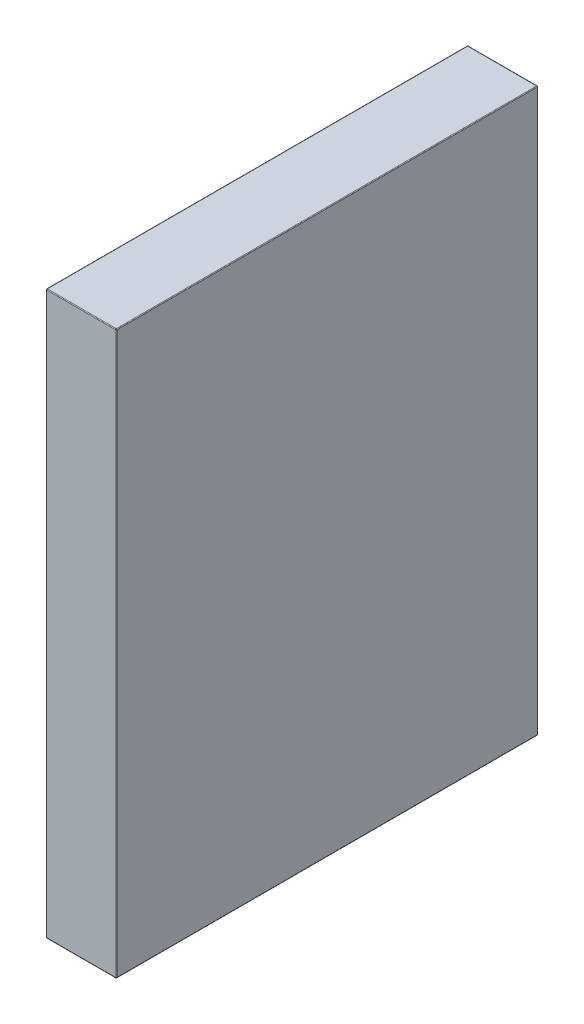
ISO-10303-21;
HEADER;
FILE_DESCRIPTION(('STEP AP214'),'2;1');
FILE_NAME('part.step','',(''),(''),'','','');
FILE_SCHEMA(('AUTOMOTIVE_DESIGN { 1 0 10303 214 1 1 1 1 }'));
ENDSEC;
DATA;
#1=APPLICATION_CONTEXT('core data for automotive mechanical design processes');
#2=APPLICATION_PROTOCOL_DEFINITION('international standard','automotive_design',2000,#1);
#3=PRODUCT_CONTEXT('',#1,'mechanical');
#4=PRODUCT('Part','Part','',(#3));
#5=PRODUCT_RELATED_PRODUCT_CATEGORY('part','',(#4));
#6=PRODUCT_DEFINITION_FORMATION('','',#4);
#7=PRODUCT_DEFINITION_CONTEXT('part definition',#1,'design');
#8=PRODUCT_DEFINITION('design','',#6,#7);
#9=PRODUCT_DEFINITION_SHAPE('','',#8);
#10=(LENGTH_UNIT() NAMED_UNIT(*) SI_UNIT(.MILLI.,.METRE.));
#11=(NAMED_UNIT(*) PLANE_ANGLE_UNIT() SI_UNIT($,.RADIAN.));
#12=(NAMED_UNIT(*) SI_UNIT($,.STERADIAN.) SOLID_ANGLE_UNIT());
#13=UNCERTAINTY_MEASURE_WITH_UNIT(LENGTH_MEASURE(1.E-05),#10,'distance_accuracy_value','');
#14=(GEOMETRIC_REPRESENTATION_CONTEXT(3) GLOBAL_UNCERTAINTY_ASSIGNED_CONTEXT((#13)) GLOBAL_UNIT_ASSIGNED_CONTEXT((#10,
#11,#12)) REPRESENTATION_CONTEXT('',''));
#15=CARTESIAN_POINT('',(0.,0.,0.));
#16=DIRECTION('',(0.,0.,1.));
#17=DIRECTION('',(1.,0.,0.));
#18=AXIS2_PLACEMENT_3D('',#15,#16,#17);
#19=CARTESIAN_POINT('',(5.,40.,60.));
#20=DIRECTION('',(0.,-1.,0.));
#21=DIRECTION('',(0.,0.,-1.));
#22=AXIS2_PLACEMENT_3D('',#19,#20,#21);
#23=PLANE('',#22);
#24=DIRECTION('',(0.,0.,-1.));
#25=VECTOR('',#24,1.);
#26=CARTESIAN_POINT('',(-4.9,40.,60.));
#27=LINE('',#26,#25);
#28=CARTESIAN_POINT('',(-4.9,40.,0.100000000000003));
#29=VERTEX_POINT('',#28);
#30=CARTESIAN_POINT('',(-4.9,40.,59.9));
#31=VERTEX_POINT('',#30);
#32=EDGE_CURVE('E138',#29,#31,#27,.F.);
#33=ORIENTED_EDGE('',*,*,#32,.T.);
#34=DIRECTION('',(-1.,0.,0.));
#35=VECTOR('',#34,1.);
#36=CARTESIAN_POINT('',(5.,40.,59.9));
#37=LINE('',#36,#35);
#38=CARTESIAN_POINT('',(4.9,40.,59.9));
#39=VERTEX_POINT('',#38);
#40=EDGE_CURVE('E175',#31,#39,#37,.F.);
#41=ORIENTED_EDGE('',*,*,#40,.T.);
#42=DIRECTION('',(0.,0.,-1.));
#43=VECTOR('',#42,1.);
#44=CARTESIAN_POINT('',(4.9,40.,60.));
#45=LINE('',#44,#43);
#46=CARTESIAN_POINT('',(4.9,40.,0.100000000000003));
#47=VERTEX_POINT('',#46);
#48=EDGE_CURVE('E172',#39,#47,#45,.T.);
#49=ORIENTED_EDGE('',*,*,#48,.T.);
#50=DIRECTION('',(-1.,0.,0.));
#51=VECTOR('',#50,1.);
#52=CARTESIAN_POINT('',(-5.,40.,0.100000000000003));
#53=LINE('',#52,#51);
#54=EDGE_CURVE('E167',#47,#29,#53,.T.);
#55=ORIENTED_EDGE('',*,*,#54,.T.);
#56=EDGE_LOOP('',(#33,#41,#49,#55));
#57=FACE_BOUND('',#56,.T.);
#58=ADVANCED_FACE('F43',(#57),#23,.F.);
#59=CARTESIAN_POINT('',(-5.,-40.,60.));
#60=DIRECTION('',(1.,0.,0.));
#61=DIRECTION('',(0.,0.,-1.));
#62=AXIS2_PLACEMENT_3D('',#59,#60,#61);
#63=PLANE('',#62);
#64=DIRECTION('',(0.,0.,-1.));
#65=VECTOR('',#64,1.);
#66=CARTESIAN_POINT('',(-5.,-39.9,60.));
#67=LINE('',#66,#65);
#68=CARTESIAN_POINT('',(-5.,-39.9,0.100000000000003));
#69=VERTEX_POINT('',#68);
#70=CARTESIAN_POINT('',(-5.,-39.9,59.9));
#71=VERTEX_POINT('',#70);
#72=EDGE_CURVE('E160',#69,#71,#67,.F.);
#73=ORIENTED_EDGE('',*,*,#72,.T.);
#74=DIRECTION('',(0.,-1.,0.));
#75=VECTOR('',#74,1.);
#76=CARTESIAN_POINT('',(-5.,-40.,59.9));
#77=LINE('',#76,#75);
#78=CARTESIAN_POINT('',(-5.,39.9,59.9));
#79=VERTEX_POINT('',#78);
#80=EDGE_CURVE('E164',#71,#79,#77,.F.);
#81=ORIENTED_EDGE('',*,*,#80,.T.);
#82=DIRECTION('',(0.,0.,-1.));
#83=VECTOR('',#82,1.);
#84=CARTESIAN_POINT('',(-5.,39.9,60.));
#85=LINE('',#84,#83);
#86=CARTESIAN_POINT('',(-5.,39.9,0.100000000000003));
#87=VERTEX_POINT('',#86);
#88=EDGE_CURVE('E136',#79,#87,#85,.T.);
#89=ORIENTED_EDGE('',*,*,#88,.T.);
#90=DIRECTION('',(0.,-1.,0.));
#91=VECTOR('',#90,1.);
#92=CARTESIAN_POINT('',(-5.,-40.,0.100000000000003));
#93=LINE('',#92,#91);
#94=EDGE_CURVE('E154',#87,#69,#93,.T.);
#95=ORIENTED_EDGE('',*,*,#94,.T.);
#96=EDGE_LOOP('',(#73,#81,#89,#95));
#97=FACE_BOUND('',#96,.T.);
#98=ADVANCED_FACE('F162',(#97),#63,.F.);
#99=CARTESIAN_POINT('',(5.,-40.,60.));
#100=DIRECTION('',(0.,1.,0.));
#101=DIRECTION('',(0.,0.,1.));
#102=AXIS2_PLACEMENT_3D('',#99,#100,#101);
#103=PLANE('',#102);
#104=DIRECTION('',(0.,0.,-1.));
#105=VECTOR('',#104,1.);
#106=CARTESIAN_POINT('',(4.9,-40.,60.));
#107=LINE('',#106,#105);
#108=CARTESIAN_POINT('',(4.9,-40.,0.100000000000003));
#109=VERTEX_POINT('',#108);
#110=CARTESIAN_POINT('',(4.9,-40.,59.9));
#111=VERTEX_POINT('',#110);
#112=EDGE_CURVE('E179',#109,#111,#107,.F.);
#113=ORIENTED_EDGE('',*,*,#112,.T.);
#114=DIRECTION('',(1.,0.,0.));
#115=VECTOR('',#114,1.);
#116=CARTESIAN_POINT('',(5.,-40.,59.9));
#117=LINE('',#116,#115);
#118=CARTESIAN_POINT('',(-4.9,-40.,59.9));
#119=VERTEX_POINT('',#118);
#120=EDGE_CURVE('E184',#111,#119,#117,.F.);
#121=ORIENTED_EDGE('',*,*,#120,.T.);
#122=DIRECTION('',(0.,0.,-1.));
#123=VECTOR('',#122,1.);
#124=CARTESIAN_POINT('',(-4.9,-40.,60.));
#125=LINE('',#124,#123);
#126=CARTESIAN_POINT('',(-4.9,-40.,0.100000000000003));
#127=VERTEX_POINT('',#126);
#128=EDGE_CURVE('E181',#119,#127,#125,.T.);
#129=ORIENTED_EDGE('',*,*,#128,.T.);
#130=DIRECTION('',(1.,0.,0.));
#131=VECTOR('',#130,1.);
#132=CARTESIAN_POINT('',(5.,-40.,0.100000000000003));
#133=LINE('',#132,#131);
#134=EDGE_CURVE('E177',#127,#109,#133,.T.);
#135=ORIENTED_EDGE('',*,*,#134,.T.);
#136=EDGE_LOOP('',(#113,#121,#129,#135));
#137=FACE_BOUND('',#136,.T.);
#138=ADVANCED_FACE('F289',(#137),#103,.F.);
#139=CARTESIAN_POINT('',(5.,-40.,60.));
#140=DIRECTION('',(-1.,0.,0.));
#141=DIRECTION('',(0.,0.,1.));
#142=AXIS2_PLACEMENT_3D('',#139,#140,#141);
#143=PLANE('',#142);
#144=DIRECTION('',(0.,0.,-1.));
#145=VECTOR('',#144,1.);
#146=CARTESIAN_POINT('',(5.,39.9,60.));
#147=LINE('',#146,#145);
#148=CARTESIAN_POINT('',(5.,39.9,0.100000000000003));
#149=VERTEX_POINT('',#148);
#150=CARTESIAN_POINT('',(5.,39.9,59.9));
#151=VERTEX_POINT('',#150);
#152=EDGE_CURVE('E188',#149,#151,#147,.F.);
#153=ORIENTED_EDGE('',*,*,#152,.T.);
#154=DIRECTION('',(0.,1.,0.));
#155=VECTOR('',#154,1.);
#156=CARTESIAN_POINT('',(5.,-40.,59.9));
#157=LINE('',#156,#155);
#158=CARTESIAN_POINT('',(5.,-39.9,59.9));
#159=VERTEX_POINT('',#158);
#160=EDGE_CURVE('E193',#151,#159,#157,.F.);
#161=ORIENTED_EDGE('',*,*,#160,.T.);
#162=DIRECTION('',(0.,0.,-1.));
#163=VECTOR('',#162,1.);
#164=CARTESIAN_POINT('',(5.,-39.9,60.));
#165=LINE('',#164,#163);
#166=CARTESIAN_POINT('',(5.,-39.9,0.100000000000003));
#167=VERTEX_POINT('',#166);
#168=EDGE_CURVE('E190',#159,#167,#165,.T.);
#169=ORIENTED_EDGE('',*,*,#168,.T.);
#170=DIRECTION('',(0.,1.,0.));
#171=VECTOR('',#170,1.);
#172=CARTESIAN_POINT('',(5.,40.,0.100000000000003));
#173=LINE('',#172,#171);
#174=EDGE_CURVE('E186',#167,#149,#173,.T.);
#175=ORIENTED_EDGE('',*,*,#174,.T.);
#176=EDGE_LOOP('',(#153,#161,#169,#175));
#177=FACE_BOUND('',#176,.T.);
#178=ADVANCED_FACE('F299',(#177),#143,.F.);
#179=CARTESIAN_POINT('',(0.,0.,60.));
#180=DIRECTION('',(0.,0.,-1.));
#181=DIRECTION('',(-1.,0.,0.));
#182=AXIS2_PLACEMENT_3D('',#179,#180,#181);
#183=PLANE('',#182);
#184=DIRECTION('',(1.,0.,0.));
#185=VECTOR('',#184,1.);
#186=CARTESIAN_POINT('',(0.,-39.9,60.));
#187=LINE('',#186,#185);
#188=CARTESIAN_POINT('',(-4.9,-39.9,60.));
#189=VERTEX_POINT('',#188);
#190=CARTESIAN_POINT('',(4.9,-39.9,60.));
#191=VERTEX_POINT('',#190);
#192=EDGE_CURVE('E199',#189,#191,#187,.T.);
#193=ORIENTED_EDGE('',*,*,#192,.T.);
#194=DIRECTION('',(0.,1.,0.));
#195=VECTOR('',#194,1.);
#196=CARTESIAN_POINT('',(4.9,0.,60.));
#197=LINE('',#196,#195);
#198=CARTESIAN_POINT('',(4.9,39.9,60.));
#199=VERTEX_POINT('',#198);
#200=EDGE_CURVE('E201',#191,#199,#197,.T.);
#201=ORIENTED_EDGE('',*,*,#200,.T.);
#202=DIRECTION('',(-1.,0.,0.));
#203=VECTOR('',#202,1.);
#204=CARTESIAN_POINT('',(0.,39.9,60.));
#205=LINE('',#204,#203);
#206=CARTESIAN_POINT('',(-4.9,39.9,60.));
#207=VERTEX_POINT('',#206);
#208=EDGE_CURVE('E195',#199,#207,#205,.T.);
#209=ORIENTED_EDGE('',*,*,#208,.T.);
#210=DIRECTION('',(0.,-1.,0.));
#211=VECTOR('',#210,1.);
#212=CARTESIAN_POINT('',(-4.9,0.,60.));
#213=LINE('',#212,#211);
#214=EDGE_CURVE('E197',#207,#189,#213,.T.);
#215=ORIENTED_EDGE('',*,*,#214,.T.);
#216=EDGE_LOOP('',(#193,#201,#209,#215));
#217=FACE_BOUND('',#216,.T.);
#218=ADVANCED_FACE('F281',(#217),#183,.F.);
#219=CARTESIAN_POINT('',(0.,0.,0.));
#220=DIRECTION('',(0.,0.,-1.));
#221=DIRECTION('',(-1.,0.,0.));
#222=AXIS2_PLACEMENT_3D('',#219,#220,#221);
#223=PLANE('',#222);
#224=DIRECTION('',(-1.,0.,0.));
#225=VECTOR('',#224,1.);
#226=CARTESIAN_POINT('',(5.,39.9,0.));
#227=LINE('',#226,#225);
#228=CARTESIAN_POINT('',(-4.9,39.9,0.));
#229=VERTEX_POINT('',#228);
#230=CARTESIAN_POINT('',(4.9,39.9,0.));
#231=VERTEX_POINT('',#230);
#232=EDGE_CURVE('E204',#229,#231,#227,.F.);
#233=ORIENTED_EDGE('',*,*,#232,.T.);
#234=DIRECTION('',(0.,1.,0.));
#235=VECTOR('',#234,1.);
#236=CARTESIAN_POINT('',(4.9,-40.,0.));
#237=LINE('',#236,#235);
#238=CARTESIAN_POINT('',(4.9,-39.9,0.));
#239=VERTEX_POINT('',#238);
#240=EDGE_CURVE('E11',#231,#239,#237,.F.);
#241=ORIENTED_EDGE('',*,*,#240,.T.);
#242=DIRECTION('',(1.,0.,0.));
#243=VECTOR('',#242,1.);
#244=CARTESIAN_POINT('',(-5.,-39.9,0.));
#245=LINE('',#244,#243);
#246=CARTESIAN_POINT('',(-4.9,-39.9,0.));
#247=VERTEX_POINT('',#246);
#248=EDGE_CURVE('E52',#239,#247,#245,.F.);
#249=ORIENTED_EDGE('',*,*,#248,.T.);
#250=DIRECTION('',(0.,-1.,0.));
#251=VECTOR('',#250,1.);
#252=CARTESIAN_POINT('',(-4.9,40.,0.));
#253=LINE('',#252,#251);
#254=EDGE_CURVE('E206',#247,#229,#253,.F.);
#255=ORIENTED_EDGE('',*,*,#254,.T.);
#256=EDGE_LOOP('',(#233,#241,#249,#255));
#257=FACE_BOUND('',#256,.T.);
#258=ADVANCED_FACE('F487',(#257),#223,.T.);
#259=CARTESIAN_POINT('',(4.9,-39.9,60.));
#260=DIRECTION('',(0.,0.,-1.));
#261=DIRECTION('',(-1.,0.,0.));
#262=AXIS2_PLACEMENT_3D('',#259,#260,#261);
#263=CYLINDRICAL_SURFACE('',#262,0.1);
#264=CARTESIAN_POINT('',(4.9,-39.9,59.9));
#265=DIRECTION('',(0.,0.,1.));
#266=DIRECTION('',(1.,0.,0.));
#267=AXIS2_PLACEMENT_3D('',#264,#265,#266);
#268=CIRCLE('',#267,0.1);
#269=EDGE_CURVE('E47',#111,#159,#268,.T.);
#270=ORIENTED_EDGE('',*,*,#269,.F.);
#271=ORIENTED_EDGE('',*,*,#112,.F.);
#272=CARTESIAN_POINT('',(4.9,-39.9,0.100000000000003));
#273=DIRECTION('',(0.,0.,-1.));
#274=DIRECTION('',(-1.,0.,0.));
#275=AXIS2_PLACEMENT_3D('',#272,#273,#274);
#276=CIRCLE('',#275,0.1);
#277=EDGE_CURVE('E259',#167,#109,#276,.T.);
#278=ORIENTED_EDGE('',*,*,#277,.F.);
#279=ORIENTED_EDGE('',*,*,#168,.F.);
#280=EDGE_LOOP('',(#270,#271,#278,#279));
#281=FACE_BOUND('',#280,.T.);
#282=ADVANCED_FACE('F45',(#281),#263,.T.);
#283=CARTESIAN_POINT('',(4.9,-39.9,59.9));
#284=DIRECTION('',(1.,0.,0.));
#285=DIRECTION('',(0.,0.,-1.));
#286=AXIS2_PLACEMENT_3D('',#283,#284,#285);
#287=SPHERICAL_SURFACE('',#286,0.1);
#288=CARTESIAN_POINT('',(4.9,-39.9,59.9));
#289=DIRECTION('',(1.,0.,0.));
#290=DIRECTION('',(0.,0.,-1.));
#291=AXIS2_PLACEMENT_3D('',#288,#289,#290);
#292=CIRCLE('',#291,0.1);
#293=EDGE_CURVE('E254',#111,#191,#292,.F.);
#294=ORIENTED_EDGE('',*,*,#293,.F.);
#295=ORIENTED_EDGE('',*,*,#269,.T.);
#296=CARTESIAN_POINT('',(4.9,-39.9,59.9));
#297=DIRECTION('',(0.,-1.,0.));
#298=DIRECTION('',(0.,0.,-1.));
#299=AXIS2_PLACEMENT_3D('',#296,#297,#298);
#300=CIRCLE('',#299,0.1);
#301=EDGE_CURVE('E257',#191,#159,#300,.F.);
#302=ORIENTED_EDGE('',*,*,#301,.F.);
#303=EDGE_LOOP('',(#294,#295,#302));
#304=FACE_BOUND('',#303,.T.);
#305=ADVANCED_FACE('F269',(#304),#287,.T.);
#306=CARTESIAN_POINT('',(4.9,-39.9,0.1));
#307=DIRECTION('',(0.,-1.,0.));
#308=DIRECTION('',(0.,0.,-1.));
#309=AXIS2_PLACEMENT_3D('',#306,#307,#308);
#310=SPHERICAL_SURFACE('',#309,0.1);
#311=CARTESIAN_POINT('',(4.9,-39.9,0.1));
#312=DIRECTION('',(0.,-1.,0.));
#313=DIRECTION('',(0.,0.,-1.));
#314=AXIS2_PLACEMENT_3D('',#311,#312,#313);
#315=CIRCLE('',#314,0.1);
#316=EDGE_CURVE('E249',#167,#239,#315,.F.);
#317=ORIENTED_EDGE('',*,*,#316,.F.);
#318=ORIENTED_EDGE('',*,*,#277,.T.);
#319=CARTESIAN_POINT('',(4.9,-39.9,0.100000000000003));
#320=DIRECTION('',(1.,0.,0.));
#321=DIRECTION('',(0.,0.,-1.));
#322=AXIS2_PLACEMENT_3D('',#319,#320,#321);
#323=CIRCLE('',#322,0.1);
#324=EDGE_CURVE('E252',#239,#109,#323,.F.);
#325=ORIENTED_EDGE('',*,*,#324,.F.);
#326=EDGE_LOOP('',(#317,#318,#325));
#327=FACE_BOUND('',#326,.T.);
#328=ADVANCED_FACE('F466',(#327),#310,.T.);
#329=CARTESIAN_POINT('',(4.9,0.,59.9));
#330=DIRECTION('',(0.,1.,0.));
#331=DIRECTION('',(0.,0.,1.));
#332=AXIS2_PLACEMENT_3D('',#329,#330,#331);
#333=CYLINDRICAL_SURFACE('',#332,0.1);
#334=ORIENTED_EDGE('',*,*,#301,.T.);
#335=ORIENTED_EDGE('',*,*,#160,.F.);
#336=CARTESIAN_POINT('',(4.9,39.9,59.9));
#337=DIRECTION('',(0.,1.,0.));
#338=DIRECTION('',(0.,0.,1.));
#339=AXIS2_PLACEMENT_3D('',#336,#337,#338);
#340=CIRCLE('',#339,0.1);
#341=EDGE_CURVE('E243',#199,#151,#340,.T.);
#342=ORIENTED_EDGE('',*,*,#341,.F.);
#343=ORIENTED_EDGE('',*,*,#200,.F.);
#344=EDGE_LOOP('',(#334,#335,#342,#343));
#345=FACE_BOUND('',#344,.T.);
#346=ADVANCED_FACE('F277',(#345),#333,.T.);
#347=CARTESIAN_POINT('',(0.,-39.9,59.9));
#348=DIRECTION('',(1.,0.,0.));
#349=DIRECTION('',(0.,0.,-1.));
#350=AXIS2_PLACEMENT_3D('',#347,#348,#349);
#351=CYLINDRICAL_SURFACE('',#350,0.1);
#352=ORIENTED_EDGE('',*,*,#293,.T.);
#353=ORIENTED_EDGE('',*,*,#192,.F.);
#354=CARTESIAN_POINT('',(-4.9,-39.9,59.9));
#355=DIRECTION('',(-1.,0.,0.));
#356=DIRECTION('',(0.,0.,1.));
#357=AXIS2_PLACEMENT_3D('',#354,#355,#356);
#358=CIRCLE('',#357,0.1);
#359=EDGE_CURVE('E240',#119,#189,#358,.T.);
#360=ORIENTED_EDGE('',*,*,#359,.F.);
#361=ORIENTED_EDGE('',*,*,#120,.F.);
#362=EDGE_LOOP('',(#352,#353,#360,#361));
#363=FACE_BOUND('',#362,.T.);
#364=ADVANCED_FACE('F286',(#363),#351,.T.);
#365=CARTESIAN_POINT('',(-4.9,-39.9,60.));
#366=DIRECTION('',(0.,0.,-1.));
#367=DIRECTION('',(-1.,0.,0.));
#368=AXIS2_PLACEMENT_3D('',#365,#366,#367);
#369=CYLINDRICAL_SURFACE('',#368,0.1);
#370=CARTESIAN_POINT('',(-4.9,-39.9,0.100000000000003));
#371=DIRECTION('',(0.,0.,-1.));
#372=DIRECTION('',(-1.,0.,0.));
#373=AXIS2_PLACEMENT_3D('',#370,#371,#372);
#374=CIRCLE('',#373,0.1);
#375=EDGE_CURVE('E234',#127,#69,#374,.T.);
#376=ORIENTED_EDGE('',*,*,#375,.F.);
#377=ORIENTED_EDGE('',*,*,#128,.F.);
#378=CARTESIAN_POINT('',(-4.9,-39.9,59.9));
#379=DIRECTION('',(0.,0.,1.));
#380=DIRECTION('',(1.,0.,0.));
#381=AXIS2_PLACEMENT_3D('',#378,#379,#380);
#382=CIRCLE('',#381,0.1);
#383=EDGE_CURVE('E237',#71,#119,#382,.T.);
#384=ORIENTED_EDGE('',*,*,#383,.F.);
#385=ORIENTED_EDGE('',*,*,#72,.F.);
#386=EDGE_LOOP('',(#376,#377,#384,#385));
#387=FACE_BOUND('',#386,.T.);
#388=ADVANCED_FACE('F293',(#387),#369,.T.);
#389=CARTESIAN_POINT('',(5.,-39.9,0.100000000000003));
#390=DIRECTION('',(-1.,0.,0.));
#391=DIRECTION('',(0.,0.,1.));
#392=AXIS2_PLACEMENT_3D('',#389,#390,#391);
#393=CYLINDRICAL_SURFACE('',#392,0.1);
#394=ORIENTED_EDGE('',*,*,#324,.T.);
#395=ORIENTED_EDGE('',*,*,#134,.F.);
#396=CARTESIAN_POINT('',(-4.9,-39.9,0.1));
#397=DIRECTION('',(-1.,0.,0.));
#398=DIRECTION('',(0.,-1.,0.));
#399=AXIS2_PLACEMENT_3D('',#396,#397,#398);
#400=CIRCLE('',#399,0.1);
#401=EDGE_CURVE('E232',#247,#127,#400,.T.);
#402=ORIENTED_EDGE('',*,*,#401,.F.);
#403=ORIENTED_EDGE('',*,*,#248,.F.);
#404=EDGE_LOOP('',(#394,#395,#402,#403));
#405=FACE_BOUND('',#404,.T.);
#406=ADVANCED_FACE('F297',(#405),#393,.T.);
#407=CARTESIAN_POINT('',(4.9,-40.,0.100000000000003));
#408=DIRECTION('',(0.,-1.,0.));
#409=DIRECTION('',(0.,0.,-1.));
#410=AXIS2_PLACEMENT_3D('',#407,#408,#409);
#411=CYLINDRICAL_SURFACE('',#410,0.1);
#412=ORIENTED_EDGE('',*,*,#316,.T.);
#413=ORIENTED_EDGE('',*,*,#240,.F.);
#414=CARTESIAN_POINT('',(4.9,39.9,0.100000000000003));
#415=DIRECTION('',(0.,1.,0.));
#416=DIRECTION('',(0.,0.,1.));
#417=AXIS2_PLACEMENT_3D('',#414,#415,#416);
#418=CIRCLE('',#417,0.1);
#419=EDGE_CURVE('E229',#149,#231,#418,.T.);
#420=ORIENTED_EDGE('',*,*,#419,.F.);
#421=ORIENTED_EDGE('',*,*,#174,.F.);
#422=EDGE_LOOP('',(#412,#413,#420,#421));
#423=FACE_BOUND('',#422,.T.);
#424=ADVANCED_FACE('F309',(#423),#411,.T.);
#425=CARTESIAN_POINT('',(4.9,39.9,60.));
#426=DIRECTION('',(0.,0.,-1.));
#427=DIRECTION('',(-1.,0.,0.));
#428=AXIS2_PLACEMENT_3D('',#425,#426,#427);
#429=CYLINDRICAL_SURFACE('',#428,0.1);
#430=CARTESIAN_POINT('',(4.9,39.9,59.9));
#431=DIRECTION('',(0.,0.,1.));
#432=DIRECTION('',(1.,0.,0.));
#433=AXIS2_PLACEMENT_3D('',#430,#431,#432);
#434=CIRCLE('',#433,0.1);
#435=EDGE_CURVE('E246',#151,#39,#434,.T.);
#436=ORIENTED_EDGE('',*,*,#435,.F.);
#437=ORIENTED_EDGE('',*,*,#152,.F.);
#438=CARTESIAN_POINT('',(4.9,39.9,0.100000000000003));
#439=DIRECTION('',(0.,0.,-1.));
#440=DIRECTION('',(-1.,0.,0.));
#441=AXIS2_PLACEMENT_3D('',#438,#439,#440);
#442=CIRCLE('',#441,0.1);
#443=EDGE_CURVE('E226',#47,#149,#442,.T.);
#444=ORIENTED_EDGE('',*,*,#443,.F.);
#445=ORIENTED_EDGE('',*,*,#48,.F.);
#446=EDGE_LOOP('',(#436,#437,#444,#445));
#447=FACE_BOUND('',#446,.T.);
#448=ADVANCED_FACE('F304',(#447),#429,.T.);
#449=CARTESIAN_POINT('',(4.9,39.9,59.9));
#450=DIRECTION('',(1.,0.,0.));
#451=DIRECTION('',(0.,0.,-1.));
#452=AXIS2_PLACEMENT_3D('',#449,#450,#451);
#453=SPHERICAL_SURFACE('',#452,0.1);
#454=ORIENTED_EDGE('',*,*,#341,.T.);
#455=ORIENTED_EDGE('',*,*,#435,.T.);
#456=CARTESIAN_POINT('',(4.9,39.9,59.9));
#457=DIRECTION('',(1.,0.,0.));
#458=DIRECTION('',(0.,0.,-1.));
#459=AXIS2_PLACEMENT_3D('',#456,#457,#458);
#460=CIRCLE('',#459,0.1);
#461=EDGE_CURVE('E223',#199,#39,#460,.F.);
#462=ORIENTED_EDGE('',*,*,#461,.F.);
#463=EDGE_LOOP('',(#454,#455,#462));
#464=FACE_BOUND('',#463,.T.);
#465=ADVANCED_FACE('F320',(#464),#453,.T.);
#466=CARTESIAN_POINT('',(-4.9,-39.9,59.9));
#467=DIRECTION('',(0.,-1.,0.));
#468=DIRECTION('',(1.,0.,0.));
#469=AXIS2_PLACEMENT_3D('',#466,#467,#468);
#470=SPHERICAL_SURFACE('',#469,0.1);
#471=ORIENTED_EDGE('',*,*,#383,.T.);
#472=ORIENTED_EDGE('',*,*,#359,.T.);
#473=CARTESIAN_POINT('',(-4.9,-39.9,59.9));
#474=DIRECTION('',(0.,-1.,0.));
#475=DIRECTION('',(0.,0.,-1.));
#476=AXIS2_PLACEMENT_3D('',#473,#474,#475);
#477=CIRCLE('',#476,0.1);
#478=EDGE_CURVE('E220',#71,#189,#477,.F.);
#479=ORIENTED_EDGE('',*,*,#478,.F.);
#480=EDGE_LOOP('',(#471,#472,#479));
#481=FACE_BOUND('',#480,.T.);
#482=ADVANCED_FACE('F330',(#481),#470,.T.);
#483=CARTESIAN_POINT('',(-4.9,-39.9,0.1));
#484=DIRECTION('',(0.,-1.,0.));
#485=DIRECTION('',(0.,0.,-1.));
#486=AXIS2_PLACEMENT_3D('',#483,#484,#485);
#487=SPHERICAL_SURFACE('',#486,0.1);
#488=ORIENTED_EDGE('',*,*,#401,.T.);
#489=ORIENTED_EDGE('',*,*,#375,.T.);
#490=CARTESIAN_POINT('',(-4.9,-39.9,0.100000000000003));
#491=DIRECTION('',(0.,-1.,0.));
#492=DIRECTION('',(0.,0.,-1.));
#493=AXIS2_PLACEMENT_3D('',#490,#491,#492);
#494=CIRCLE('',#493,0.1);
#495=EDGE_CURVE('E157',#247,#69,#494,.F.);
#496=ORIENTED_EDGE('',*,*,#495,.F.);
#497=EDGE_LOOP('',(#488,#489,#496));
#498=FACE_BOUND('',#497,.T.);
#499=ADVANCED_FACE('F332',(#498),#487,.T.);
#500=CARTESIAN_POINT('',(4.9,39.9,0.1));
#501=DIRECTION('',(1.,0.,0.));
#502=DIRECTION('',(0.,0.,-1.));
#503=AXIS2_PLACEMENT_3D('',#500,#501,#502);
#504=SPHERICAL_SURFACE('',#503,0.1);
#505=ORIENTED_EDGE('',*,*,#443,.T.);
#506=ORIENTED_EDGE('',*,*,#419,.T.);
#507=CARTESIAN_POINT('',(4.9,39.9,0.1));
#508=DIRECTION('',(1.,0.,0.));
#509=DIRECTION('',(0.,0.,-1.));
#510=AXIS2_PLACEMENT_3D('',#507,#508,#509);
#511=CIRCLE('',#510,0.1);
#512=EDGE_CURVE('E216',#47,#231,#511,.F.);
#513=ORIENTED_EDGE('',*,*,#512,.F.);
#514=EDGE_LOOP('',(#505,#506,#513));
#515=FACE_BOUND('',#514,.T.);
#516=ADVANCED_FACE('F311',(#515),#504,.T.);
#517=CARTESIAN_POINT('',(0.,39.9,59.9));
#518=DIRECTION('',(-1.,0.,0.));
#519=DIRECTION('',(0.,0.,1.));
#520=AXIS2_PLACEMENT_3D('',#517,#518,#519);
#521=CYLINDRICAL_SURFACE('',#520,0.1);
#522=ORIENTED_EDGE('',*,*,#461,.T.);
#523=ORIENTED_EDGE('',*,*,#40,.F.);
#524=CARTESIAN_POINT('',(-4.9,39.9,59.9));
#525=DIRECTION('',(-1.,0.,0.));
#526=DIRECTION('',(0.,0.,1.));
#527=AXIS2_PLACEMENT_3D('',#524,#525,#526);
#528=CIRCLE('',#527,0.1);
#529=EDGE_CURVE('E213',#207,#31,#528,.T.);
#530=ORIENTED_EDGE('',*,*,#529,.F.);
#531=ORIENTED_EDGE('',*,*,#208,.F.);
#532=EDGE_LOOP('',(#522,#523,#530,#531));
#533=FACE_BOUND('',#532,.T.);
#534=ADVANCED_FACE('F322',(#533),#521,.T.);
#535=CARTESIAN_POINT('',(-4.9,0.,59.9));
#536=DIRECTION('',(0.,-1.,0.));
#537=DIRECTION('',(0.,0.,-1.));
#538=AXIS2_PLACEMENT_3D('',#535,#536,#537);
#539=CYLINDRICAL_SURFACE('',#538,0.1);
#540=ORIENTED_EDGE('',*,*,#478,.T.);
#541=ORIENTED_EDGE('',*,*,#214,.F.);
#542=CARTESIAN_POINT('',(-4.9,39.9,59.9));
#543=DIRECTION('',(0.,1.,0.));
#544=DIRECTION('',(0.,0.,1.));
#545=AXIS2_PLACEMENT_3D('',#542,#543,#544);
#546=CIRCLE('',#545,0.1);
#547=EDGE_CURVE('E151',#79,#207,#546,.T.);
#548=ORIENTED_EDGE('',*,*,#547,.F.);
#549=ORIENTED_EDGE('',*,*,#80,.F.);
#550=EDGE_LOOP('',(#540,#541,#548,#549));
#551=FACE_BOUND('',#550,.T.);
#552=ADVANCED_FACE('F328',(#551),#539,.T.);
#553=CARTESIAN_POINT('',(-4.9,-40.,0.100000000000003));
#554=DIRECTION('',(0.,1.,0.));
#555=DIRECTION('',(0.,0.,1.));
#556=AXIS2_PLACEMENT_3D('',#553,#554,#555);
#557=CYLINDRICAL_SURFACE('',#556,0.1);
#558=ORIENTED_EDGE('',*,*,#495,.T.);
#559=ORIENTED_EDGE('',*,*,#94,.F.);
#560=CARTESIAN_POINT('',(-4.9,39.9,0.1));
#561=DIRECTION('',(0.,1.,0.));
#562=DIRECTION('',(0.,0.,1.));
#563=AXIS2_PLACEMENT_3D('',#560,#561,#562);
#564=CIRCLE('',#563,0.1);
#565=EDGE_CURVE('E144',#229,#87,#564,.T.);
#566=ORIENTED_EDGE('',*,*,#565,.F.);
#567=ORIENTED_EDGE('',*,*,#254,.F.);
#568=EDGE_LOOP('',(#558,#559,#566,#567));
#569=FACE_BOUND('',#568,.T.);
#570=ADVANCED_FACE('F155',(#569),#557,.T.);
#571=CARTESIAN_POINT('',(5.,39.9,0.100000000000003));
#572=DIRECTION('',(1.,0.,0.));
#573=DIRECTION('',(0.,0.,-1.));
#574=AXIS2_PLACEMENT_3D('',#571,#572,#573);
#575=CYLINDRICAL_SURFACE('',#574,0.1);
#576=ORIENTED_EDGE('',*,*,#512,.T.);
#577=ORIENTED_EDGE('',*,*,#232,.F.);
#578=CARTESIAN_POINT('',(-4.9,39.9,0.100000000000003));
#579=DIRECTION('',(-1.,0.,0.));
#580=DIRECTION('',(0.,0.,1.));
#581=AXIS2_PLACEMENT_3D('',#578,#579,#580);
#582=CIRCLE('',#581,0.1);
#583=EDGE_CURVE('E148',#29,#229,#582,.T.);
#584=ORIENTED_EDGE('',*,*,#583,.F.);
#585=ORIENTED_EDGE('',*,*,#54,.F.);
#586=EDGE_LOOP('',(#576,#577,#584,#585));
#587=FACE_BOUND('',#586,.T.);
#588=ADVANCED_FACE('F315',(#587),#575,.T.);
#589=CARTESIAN_POINT('',(-4.9,39.9,59.9));
#590=DIRECTION('',(0.,0.,1.));
#591=DIRECTION('',(1.,0.,0.));
#592=AXIS2_PLACEMENT_3D('',#589,#590,#591);
#593=SPHERICAL_SURFACE('',#592,0.1);
#594=ORIENTED_EDGE('',*,*,#547,.T.);
#595=ORIENTED_EDGE('',*,*,#529,.T.);
#596=CARTESIAN_POINT('',(-4.9,39.9,59.9));
#597=DIRECTION('',(0.,0.,1.));
#598=DIRECTION('',(1.,0.,0.));
#599=AXIS2_PLACEMENT_3D('',#596,#597,#598);
#600=CIRCLE('',#599,0.1);
#601=EDGE_CURVE('E141',#79,#31,#600,.F.);
#602=ORIENTED_EDGE('',*,*,#601,.F.);
#603=EDGE_LOOP('',(#594,#595,#602));
#604=FACE_BOUND('',#603,.T.);
#605=ADVANCED_FACE('F326',(#604),#593,.T.);
#606=CARTESIAN_POINT('',(-4.9,39.9,0.1));
#607=DIRECTION('',(0.,0.,-1.));
#608=DIRECTION('',(-1.,0.,0.));
#609=AXIS2_PLACEMENT_3D('',#606,#607,#608);
#610=SPHERICAL_SURFACE('',#609,0.1);
#611=ORIENTED_EDGE('',*,*,#583,.T.);
#612=ORIENTED_EDGE('',*,*,#565,.T.);
#613=CARTESIAN_POINT('',(-4.9,39.9,0.100000000000003));
#614=DIRECTION('',(0.,0.,-1.));
#615=DIRECTION('',(-1.,0.,0.));
#616=AXIS2_PLACEMENT_3D('',#613,#614,#615);
#617=CIRCLE('',#616,0.1);
#618=EDGE_CURVE('E132',#29,#87,#617,.F.);
#619=ORIENTED_EDGE('',*,*,#618,.F.);
#620=EDGE_LOOP('',(#611,#612,#619));
#621=FACE_BOUND('',#620,.T.);
#622=ADVANCED_FACE('F146',(#621),#610,.T.);
#623=CARTESIAN_POINT('',(-4.9,39.9,60.));
#624=DIRECTION('',(0.,0.,-1.));
#625=DIRECTION('',(-1.,0.,0.));
#626=AXIS2_PLACEMENT_3D('',#623,#624,#625);
#627=CYLINDRICAL_SURFACE('',#626,0.1);
#628=ORIENTED_EDGE('',*,*,#601,.T.);
#629=ORIENTED_EDGE('',*,*,#32,.F.);
#630=ORIENTED_EDGE('',*,*,#618,.T.);
#631=ORIENTED_EDGE('',*,*,#88,.F.);
#632=EDGE_LOOP('',(#628,#629,#630,#631));
#633=FACE_BOUND('',#632,.T.);
#634=ADVANCED_FACE('F134',(#633),#627,.T.);
#635=CLOSED_SHELL('',(#58,#98,#138,#178,#218,#258,#282,#305,#328,#346,#364,#388,#406,#424,#448,
#465,#482,#499,#516,#534,#552,#570,#588,#605,#622,#634));
#636=MANIFOLD_SOLID_BREP('B2',#635);
#637=ADVANCED_BREP_SHAPE_REPRESENTATION('',(#18,#636),#14);
#638=SHAPE_DEFINITION_REPRESENTATION(#9,#637);
ENDSEC;
END-ISO-10303-21;
